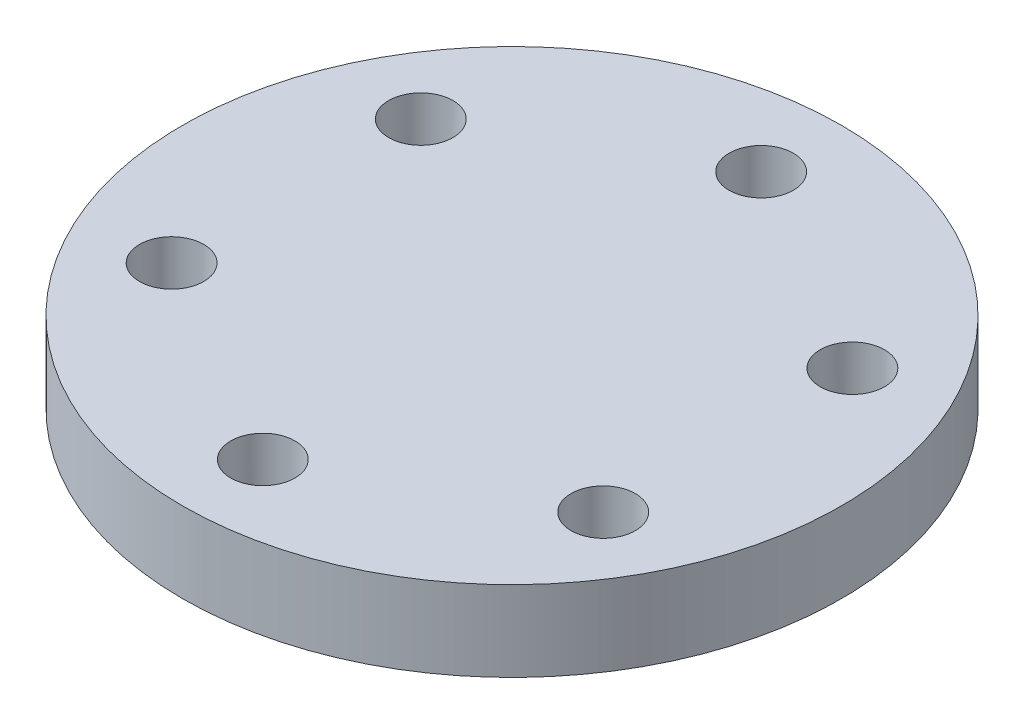
ISO-10303-21;
HEADER;
FILE_DESCRIPTION(('STEP AP214'),'2;1');
FILE_NAME('part.step','',(''),(''),'','','');
FILE_SCHEMA(('AUTOMOTIVE_DESIGN { 1 0 10303 214 1 1 1 1 }'));
ENDSEC;
DATA;
#1=APPLICATION_CONTEXT('core data for automotive mechanical design processes');
#2=APPLICATION_PROTOCOL_DEFINITION('international standard','automotive_design',2000,#1);
#3=PRODUCT_CONTEXT('',#1,'mechanical');
#4=PRODUCT('Part','Part','',(#3));
#5=PRODUCT_RELATED_PRODUCT_CATEGORY('part','',(#4));
#6=PRODUCT_DEFINITION_FORMATION('','',#4);
#7=PRODUCT_DEFINITION_CONTEXT('part definition',#1,'design');
#8=PRODUCT_DEFINITION('design','',#6,#7);
#9=PRODUCT_DEFINITION_SHAPE('','',#8);
#10=(LENGTH_UNIT() NAMED_UNIT(*) SI_UNIT(.MILLI.,.METRE.));
#11=(NAMED_UNIT(*) PLANE_ANGLE_UNIT() SI_UNIT($,.RADIAN.));
#12=(NAMED_UNIT(*) SI_UNIT($,.STERADIAN.) SOLID_ANGLE_UNIT());
#13=UNCERTAINTY_MEASURE_WITH_UNIT(LENGTH_MEASURE(1.E-05),#10,'distance_accuracy_value','');
#14=(GEOMETRIC_REPRESENTATION_CONTEXT(3) GLOBAL_UNCERTAINTY_ASSIGNED_CONTEXT((#13)) GLOBAL_UNIT_ASSIGNED_CONTEXT((#10,
#11,#12)) REPRESENTATION_CONTEXT('',''));
#15=CARTESIAN_POINT('',(0.,0.,0.));
#16=DIRECTION('',(0.,0.,1.));
#17=DIRECTION('',(1.,0.,0.));
#18=AXIS2_PLACEMENT_3D('',#15,#16,#17);
#19=CARTESIAN_POINT('',(0.,5.,0.));
#20=DIRECTION('',(0.,-1.,0.));
#21=DIRECTION('',(0.,0.,-1.));
#22=AXIS2_PLACEMENT_3D('',#19,#20,#21);
#23=CYLINDRICAL_SURFACE('',#22,20.5);
#24=CARTESIAN_POINT('',(0.,5.,0.));
#25=DIRECTION('',(0.,1.,0.));
#26=DIRECTION('',(0.,0.,1.));
#27=AXIS2_PLACEMENT_3D('',#24,#25,#26);
#28=CIRCLE('',#27,20.5);
#29=CARTESIAN_POINT('',(0.,5.,20.5));
#30=VERTEX_POINT('',#29);
#31=EDGE_CURVE('E10',#30,#30,#28,.T.);
#32=ORIENTED_EDGE('',*,*,#31,.F.);
#33=EDGE_LOOP('',(#32));
#34=FACE_BOUND('',#33,.T.);
#35=CARTESIAN_POINT('',(0.,0.,0.));
#36=DIRECTION('',(0.,1.,0.));
#37=DIRECTION('',(0.,0.,1.));
#38=AXIS2_PLACEMENT_3D('',#35,#36,#37);
#39=CIRCLE('',#38,20.5);
#40=CARTESIAN_POINT('',(0.,0.,20.5));
#41=VERTEX_POINT('',#40);
#42=EDGE_CURVE('E37',#41,#41,#39,.T.);
#43=ORIENTED_EDGE('',*,*,#42,.T.);
#44=EDGE_LOOP('',(#43));
#45=FACE_BOUND('',#44,.T.);
#46=ADVANCED_FACE('F34',(#34,#45),#23,.T.);
#47=CARTESIAN_POINT('',(0.,5.,0.));
#48=DIRECTION('',(0.,1.,0.));
#49=DIRECTION('',(0.,0.,1.));
#50=AXIS2_PLACEMENT_3D('',#47,#48,#49);
#51=PLANE('',#50);
#52=CARTESIAN_POINT('',(13.4233937586587,5.,-7.75000000000016));
#53=DIRECTION('',(0.,1.,0.));
#54=DIRECTION('',(-0.866025403784433,0.,0.50000000000001));
#55=AXIS2_PLACEMENT_3D('',#52,#53,#54);
#56=CIRCLE('',#55,2.);
#57=CARTESIAN_POINT('',(11.6913429510898,5.,-6.75000000000014));
#58=VERTEX_POINT('',#57);
#59=EDGE_CURVE('E62',#58,#58,#56,.T.);
#60=ORIENTED_EDGE('',*,*,#59,.F.);
#61=EDGE_LOOP('',(#60));
#62=FACE_BOUND('',#61,.T.);
#63=CARTESIAN_POINT('',(13.4233937586589,5.,7.74999999999987));
#64=DIRECTION('',(0.,1.,0.));
#65=DIRECTION('',(-0.866025403784443,0.,-0.499999999999992));
#66=AXIS2_PLACEMENT_3D('',#63,#64,#65);
#67=CIRCLE('',#66,2.);
#68=CARTESIAN_POINT('',(11.69134295109,5.,6.74999999999989));
#69=VERTEX_POINT('',#68);
#70=EDGE_CURVE('E61',#69,#69,#67,.T.);
#71=ORIENTED_EDGE('',*,*,#70,.F.);
#72=EDGE_LOOP('',(#71));
#73=FACE_BOUND('',#72,.T.);
#74=CARTESIAN_POINT('',(0.,5.,15.5));
#75=DIRECTION('',(0.,1.,0.));
#76=DIRECTION('',(0.,0.,-1.));
#77=AXIS2_PLACEMENT_3D('',#74,#75,#76);
#78=CIRCLE('',#77,2.);
#79=CARTESIAN_POINT('',(0.,5.,13.5));
#80=VERTEX_POINT('',#79);
#81=EDGE_CURVE('E68',#80,#80,#78,.T.);
#82=ORIENTED_EDGE('',*,*,#81,.F.);
#83=EDGE_LOOP('',(#82));
#84=FACE_BOUND('',#83,.T.);
#85=CARTESIAN_POINT('',(-13.4233937586588,5.,7.75000000000006));
#86=DIRECTION('',(0.,1.,0.));
#87=DIRECTION('',(0.866025403784436,0.,-0.500000000000004));
#88=AXIS2_PLACEMENT_3D('',#85,#86,#87);
#89=CIRCLE('',#88,2.);
#90=CARTESIAN_POINT('',(-11.6913429510899,5.,6.75000000000005));
#91=VERTEX_POINT('',#90);
#92=EDGE_CURVE('E74',#91,#91,#89,.T.);
#93=ORIENTED_EDGE('',*,*,#92,.F.);
#94=EDGE_LOOP('',(#93));
#95=FACE_BOUND('',#94,.T.);
#96=CARTESIAN_POINT('',(-13.4233937586588,5.,-7.74999999999997));
#97=DIRECTION('',(0.,1.,0.));
#98=DIRECTION('',(0.86602540378444,0.,0.499999999999998));
#99=AXIS2_PLACEMENT_3D('',#96,#97,#98);
#100=CIRCLE('',#99,2.);
#101=CARTESIAN_POINT('',(-11.6913429510899,5.,-6.74999999999997));
#102=VERTEX_POINT('',#101);
#103=EDGE_CURVE('E54',#102,#102,#100,.T.);
#104=ORIENTED_EDGE('',*,*,#103,.F.);
#105=EDGE_LOOP('',(#104));
#106=FACE_BOUND('',#105,.T.);
#107=CARTESIAN_POINT('',(0.,5.,-15.5));
#108=DIRECTION('',(0.,1.,0.));
#109=DIRECTION('',(0.,0.,1.));
#110=AXIS2_PLACEMENT_3D('',#107,#108,#109);
#111=CIRCLE('',#110,2.);
#112=CARTESIAN_POINT('',(0.,5.,-13.5));
#113=VERTEX_POINT('',#112);
#114=EDGE_CURVE('E48',#113,#113,#111,.T.);
#115=ORIENTED_EDGE('',*,*,#114,.F.);
#116=EDGE_LOOP('',(#115));
#117=FACE_BOUND('',#116,.T.);
#118=ORIENTED_EDGE('',*,*,#31,.T.);
#119=EDGE_LOOP('',(#118));
#120=FACE_BOUND('',#119,.T.);
#121=ADVANCED_FACE('F85',(#62,#73,#84,#95,#106,#117,#120),#51,.T.);
#122=CARTESIAN_POINT('',(0.,0.,0.));
#123=DIRECTION('',(0.,1.,0.));
#124=DIRECTION('',(0.,0.,1.));
#125=AXIS2_PLACEMENT_3D('',#122,#123,#124);
#126=PLANE('',#125);
#127=CARTESIAN_POINT('',(13.4233937586587,0.,-7.75000000000016));
#128=DIRECTION('',(0.,1.,0.));
#129=DIRECTION('',(0.,0.,1.));
#130=AXIS2_PLACEMENT_3D('',#127,#128,#129);
#131=CIRCLE('',#130,2.);
#132=CARTESIAN_POINT('',(13.4233937586587,0.,-5.75000000000016));
#133=VERTEX_POINT('',#132);
#134=EDGE_CURVE('E58',#133,#133,#131,.F.);
#135=ORIENTED_EDGE('',*,*,#134,.F.);
#136=EDGE_LOOP('',(#135));
#137=FACE_BOUND('',#136,.T.);
#138=CARTESIAN_POINT('',(13.4233937586589,0.,7.74999999999987));
#139=DIRECTION('',(0.,1.,0.));
#140=DIRECTION('',(0.,0.,1.));
#141=AXIS2_PLACEMENT_3D('',#138,#139,#140);
#142=CIRCLE('',#141,2.);
#143=CARTESIAN_POINT('',(13.4233937586589,0.,9.74999999999988));
#144=VERTEX_POINT('',#143);
#145=EDGE_CURVE('E65',#144,#144,#142,.F.);
#146=ORIENTED_EDGE('',*,*,#145,.F.);
#147=EDGE_LOOP('',(#146));
#148=FACE_BOUND('',#147,.T.);
#149=CARTESIAN_POINT('',(0.,0.,15.5));
#150=DIRECTION('',(0.,1.,0.));
#151=DIRECTION('',(0.,0.,1.));
#152=AXIS2_PLACEMENT_3D('',#149,#150,#151);
#153=CIRCLE('',#152,2.);
#154=CARTESIAN_POINT('',(0.,0.,17.5));
#155=VERTEX_POINT('',#154);
#156=EDGE_CURVE('E71',#155,#155,#153,.F.);
#157=ORIENTED_EDGE('',*,*,#156,.F.);
#158=EDGE_LOOP('',(#157));
#159=FACE_BOUND('',#158,.T.);
#160=CARTESIAN_POINT('',(-13.4233937586588,0.,7.75000000000006));
#161=DIRECTION('',(0.,1.,0.));
#162=DIRECTION('',(0.,0.,1.));
#163=AXIS2_PLACEMENT_3D('',#160,#161,#162);
#164=CIRCLE('',#163,2.);
#165=CARTESIAN_POINT('',(-13.4233937586588,0.,9.75000000000006));
#166=VERTEX_POINT('',#165);
#167=EDGE_CURVE('E57',#166,#166,#164,.F.);
#168=ORIENTED_EDGE('',*,*,#167,.F.);
#169=EDGE_LOOP('',(#168));
#170=FACE_BOUND('',#169,.T.);
#171=CARTESIAN_POINT('',(-13.4233937586588,0.,-7.74999999999997));
#172=DIRECTION('',(0.,1.,0.));
#173=DIRECTION('',(0.,0.,1.));
#174=AXIS2_PLACEMENT_3D('',#171,#172,#173);
#175=CIRCLE('',#174,2.);
#176=CARTESIAN_POINT('',(-13.4233937586588,0.,-5.74999999999997));
#177=VERTEX_POINT('',#176);
#178=EDGE_CURVE('E51',#177,#177,#175,.F.);
#179=ORIENTED_EDGE('',*,*,#178,.F.);
#180=EDGE_LOOP('',(#179));
#181=FACE_BOUND('',#180,.T.);
#182=CARTESIAN_POINT('',(0.,0.,-15.5));
#183=DIRECTION('',(0.,1.,0.));
#184=DIRECTION('',(0.,0.,1.));
#185=AXIS2_PLACEMENT_3D('',#182,#183,#184);
#186=CIRCLE('',#185,2.);
#187=CARTESIAN_POINT('',(0.,0.,-13.5));
#188=VERTEX_POINT('',#187);
#189=EDGE_CURVE('E44',#188,#188,#186,.F.);
#190=ORIENTED_EDGE('',*,*,#189,.F.);
#191=EDGE_LOOP('',(#190));
#192=FACE_BOUND('',#191,.T.);
#193=ORIENTED_EDGE('',*,*,#42,.F.);
#194=EDGE_LOOP('',(#193));
#195=FACE_BOUND('',#194,.T.);
#196=ADVANCED_FACE('F88',(#137,#148,#159,#170,#181,#192,#195),#126,.F.);
#197=CARTESIAN_POINT('',(0.,-0.00100000000000013,-15.5));
#198=DIRECTION('',(0.,1.,0.));
#199=DIRECTION('',(0.,0.,1.));
#200=AXIS2_PLACEMENT_3D('',#197,#198,#199);
#201=CYLINDRICAL_SURFACE('',#200,2.);
#202=ORIENTED_EDGE('',*,*,#114,.T.);
#203=EDGE_LOOP('',(#202));
#204=FACE_BOUND('',#203,.T.);
#205=ORIENTED_EDGE('',*,*,#189,.T.);
#206=EDGE_LOOP('',(#205));
#207=FACE_BOUND('',#206,.T.);
#208=ADVANCED_FACE('F95',(#204,#207),#201,.F.);
#209=CARTESIAN_POINT('',(-13.4233937586588,-0.00100000000000013,-7.74999999999997));
#210=DIRECTION('',(0.,1.,0.));
#211=DIRECTION('',(0.,0.,1.));
#212=AXIS2_PLACEMENT_3D('',#209,#210,#211);
#213=CYLINDRICAL_SURFACE('',#212,2.);
#214=ORIENTED_EDGE('',*,*,#103,.T.);
#215=EDGE_LOOP('',(#214));
#216=FACE_BOUND('',#215,.T.);
#217=ORIENTED_EDGE('',*,*,#178,.T.);
#218=EDGE_LOOP('',(#217));
#219=FACE_BOUND('',#218,.T.);
#220=ADVANCED_FACE('F98',(#216,#219),#213,.F.);
#221=CARTESIAN_POINT('',(-13.4233937586588,-0.00100000000000013,7.75000000000006));
#222=DIRECTION('',(0.,1.,0.));
#223=DIRECTION('',(0.,0.,1.));
#224=AXIS2_PLACEMENT_3D('',#221,#222,#223);
#225=CYLINDRICAL_SURFACE('',#224,2.);
#226=ORIENTED_EDGE('',*,*,#92,.T.);
#227=EDGE_LOOP('',(#226));
#228=FACE_BOUND('',#227,.T.);
#229=ORIENTED_EDGE('',*,*,#167,.T.);
#230=EDGE_LOOP('',(#229));
#231=FACE_BOUND('',#230,.T.);
#232=ADVANCED_FACE('F82',(#228,#231),#225,.F.);
#233=CARTESIAN_POINT('',(0.,-0.00100000000000013,15.5));
#234=DIRECTION('',(0.,1.,0.));
#235=DIRECTION('',(0.,0.,1.));
#236=AXIS2_PLACEMENT_3D('',#233,#234,#235);
#237=CYLINDRICAL_SURFACE('',#236,2.);
#238=ORIENTED_EDGE('',*,*,#81,.T.);
#239=EDGE_LOOP('',(#238));
#240=FACE_BOUND('',#239,.T.);
#241=ORIENTED_EDGE('',*,*,#156,.T.);
#242=EDGE_LOOP('',(#241));
#243=FACE_BOUND('',#242,.T.);
#244=ADVANCED_FACE('F136',(#240,#243),#237,.F.);
#245=CARTESIAN_POINT('',(13.4233937586589,-0.00100000000000013,7.74999999999987));
#246=DIRECTION('',(0.,1.,0.));
#247=DIRECTION('',(0.,0.,1.));
#248=AXIS2_PLACEMENT_3D('',#245,#246,#247);
#249=CYLINDRICAL_SURFACE('',#248,2.);
#250=ORIENTED_EDGE('',*,*,#70,.T.);
#251=EDGE_LOOP('',(#250));
#252=FACE_BOUND('',#251,.T.);
#253=ORIENTED_EDGE('',*,*,#145,.T.);
#254=EDGE_LOOP('',(#253));
#255=FACE_BOUND('',#254,.T.);
#256=ADVANCED_FACE('F143',(#252,#255),#249,.F.);
#257=CARTESIAN_POINT('',(13.4233937586587,-0.00100000000000013,-7.75000000000016));
#258=DIRECTION('',(0.,1.,0.));
#259=DIRECTION('',(0.,0.,1.));
#260=AXIS2_PLACEMENT_3D('',#257,#258,#259);
#261=CYLINDRICAL_SURFACE('',#260,2.);
#262=ORIENTED_EDGE('',*,*,#59,.T.);
#263=EDGE_LOOP('',(#262));
#264=FACE_BOUND('',#263,.T.);
#265=ORIENTED_EDGE('',*,*,#134,.T.);
#266=EDGE_LOOP('',(#265));
#267=FACE_BOUND('',#266,.T.);
#268=ADVANCED_FACE('F151',(#264,#267),#261,.F.);
#269=CLOSED_SHELL('',(#46,#121,#196,#208,#220,#232,#244,#256,#268));
#270=MANIFOLD_SOLID_BREP('B2',#269);
#271=ADVANCED_BREP_SHAPE_REPRESENTATION('',(#18,#270),#14);
#272=SHAPE_DEFINITION_REPRESENTATION(#9,#271);
ENDSEC;
END-ISO-10303-21;
